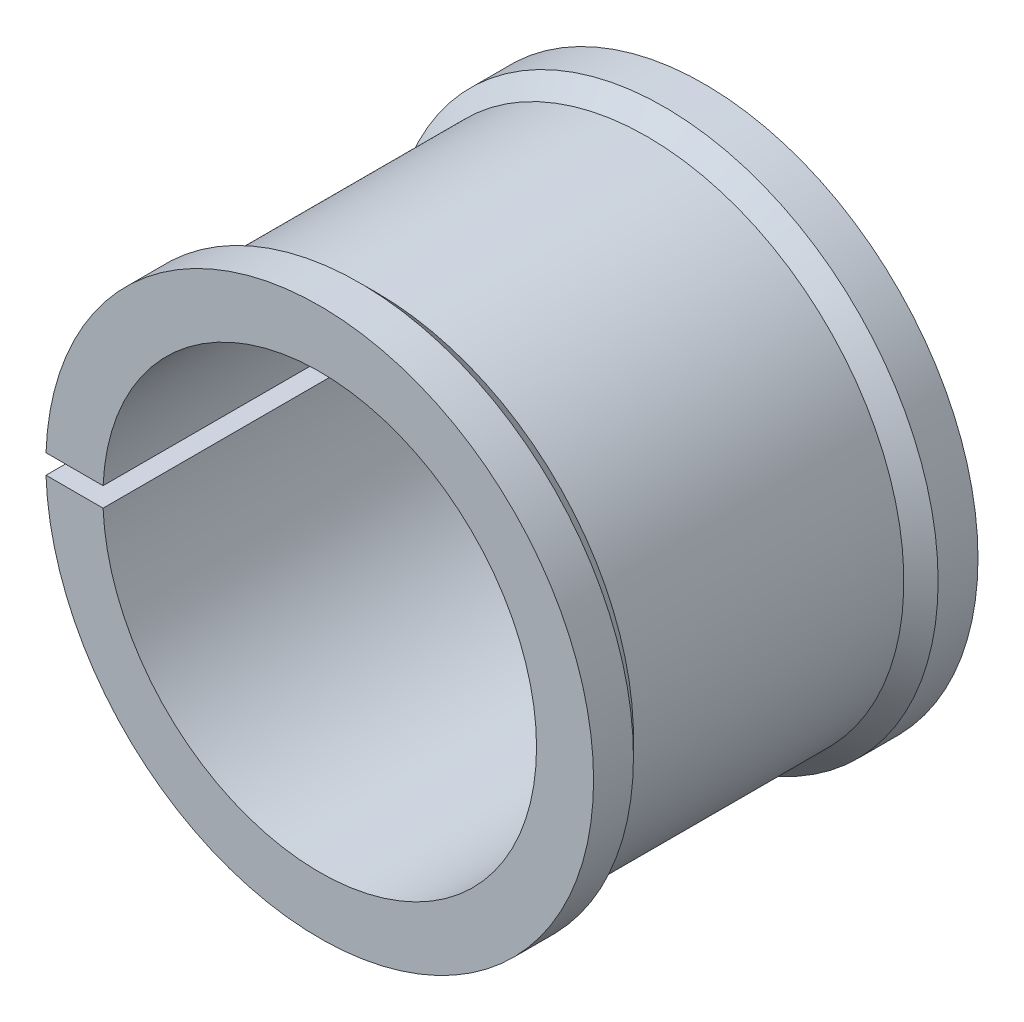
ISO-10303-21;
HEADER;
FILE_DESCRIPTION(('STEP AP214'),'2;1');
FILE_NAME('part.step','',(''),(''),'','','');
FILE_SCHEMA(('AUTOMOTIVE_DESIGN { 1 0 10303 214 1 1 1 1 }'));
ENDSEC;
DATA;
#1=APPLICATION_CONTEXT('core data for automotive mechanical design processes');
#2=APPLICATION_PROTOCOL_DEFINITION('international standard','automotive_design',2000,#1);
#3=PRODUCT_CONTEXT('',#1,'mechanical');
#4=PRODUCT('Part','Part','',(#3));
#5=PRODUCT_RELATED_PRODUCT_CATEGORY('part','',(#4));
#6=PRODUCT_DEFINITION_FORMATION('','',#4);
#7=PRODUCT_DEFINITION_CONTEXT('part definition',#1,'design');
#8=PRODUCT_DEFINITION('design','',#6,#7);
#9=PRODUCT_DEFINITION_SHAPE('','',#8);
#10=(LENGTH_UNIT() NAMED_UNIT(*) SI_UNIT(.MILLI.,.METRE.));
#11=(NAMED_UNIT(*) PLANE_ANGLE_UNIT() SI_UNIT($,.RADIAN.));
#12=(NAMED_UNIT(*) SI_UNIT($,.STERADIAN.) SOLID_ANGLE_UNIT());
#13=UNCERTAINTY_MEASURE_WITH_UNIT(LENGTH_MEASURE(1.E-05),#10,'distance_accuracy_value','');
#14=(GEOMETRIC_REPRESENTATION_CONTEXT(3) GLOBAL_UNCERTAINTY_ASSIGNED_CONTEXT((#13)) GLOBAL_UNIT_ASSIGNED_CONTEXT((#10,
#11,#12)) REPRESENTATION_CONTEXT('',''));
#15=CARTESIAN_POINT('',(0.,0.,0.));
#16=DIRECTION('',(0.,0.,1.));
#17=DIRECTION('',(1.,0.,0.));
#18=AXIS2_PLACEMENT_3D('',#15,#16,#17);
#19=CARTESIAN_POINT('',(0.,0.,22.56));
#20=DIRECTION('',(0.,0.,-1.));
#21=DIRECTION('',(-1.,0.,0.));
#22=AXIS2_PLACEMENT_3D('',#19,#20,#21);
#23=CYLINDRICAL_SURFACE('',#22,25.75);
#24=CARTESIAN_POINT('',(0.,0.,24.8400000000001));
#25=DIRECTION('',(0.,0.,1.));
#26=DIRECTION('',(1.,0.,0.));
#27=AXIS2_PLACEMENT_3D('',#24,#25,#26);
#28=CIRCLE('',#27,25.75);
#29=CARTESIAN_POINT('',(-25.7315346413695,0.975,24.8400000000001));
#30=VERTEX_POINT('',#29);
#31=CARTESIAN_POINT('',(-25.7315346413695,-0.975,24.8400000000001));
#32=VERTEX_POINT('',#31);
#33=EDGE_CURVE('E130',#30,#32,#28,.F.);
#34=ORIENTED_EDGE('',*,*,#33,.T.);
#35=DIRECTION('',(0.,0.,-1.));
#36=VECTOR('',#35,1.);
#37=CARTESIAN_POINT('',(-25.7315346413695,-0.975,22.56));
#38=LINE('',#37,#36);
#39=CARTESIAN_POINT('',(-25.7315346413695,-0.975,-2.28000000000005));
#40=VERTEX_POINT('',#39);
#41=EDGE_CURVE('E149',#32,#40,#38,.T.);
#42=ORIENTED_EDGE('',*,*,#41,.T.);
#43=CARTESIAN_POINT('',(0.,0.,-2.28000000000005));
#44=DIRECTION('',(0.,0.,-1.));
#45=DIRECTION('',(-1.,0.,0.));
#46=AXIS2_PLACEMENT_3D('',#43,#44,#45);
#47=CIRCLE('',#46,25.75);
#48=CARTESIAN_POINT('',(-25.7315346413695,0.975,-2.28000000000005));
#49=VERTEX_POINT('',#48);
#50=EDGE_CURVE('E135',#40,#49,#47,.F.);
#51=ORIENTED_EDGE('',*,*,#50,.T.);
#52=DIRECTION('',(0.,0.,-1.));
#53=VECTOR('',#52,1.);
#54=CARTESIAN_POINT('',(-25.7315346413695,0.975,22.56));
#55=LINE('',#54,#53);
#56=EDGE_CURVE('E151',#49,#30,#55,.F.);
#57=ORIENTED_EDGE('',*,*,#56,.T.);
#58=EDGE_LOOP('',(#34,#42,#51,#57));
#59=FACE_BOUND('',#58,.T.);
#60=ADVANCED_FACE('F32',(#59),#23,.T.);
#61=CARTESIAN_POINT('',(0.,0.,30.56));
#62=DIRECTION('',(0.,0.,-1.));
#63=DIRECTION('',(-1.,0.,0.));
#64=AXIS2_PLACEMENT_3D('',#61,#62,#63);
#65=CYLINDRICAL_SURFACE('',#64,27.47);
#66=CARTESIAN_POINT('',(0.,0.,30.56));
#67=DIRECTION('',(0.,0.,1.));
#68=DIRECTION('',(1.,0.,0.));
#69=AXIS2_PLACEMENT_3D('',#66,#67,#68);
#70=CIRCLE('',#69,27.47);
#71=CARTESIAN_POINT('',(-27.452691580244,-0.975,30.56));
#72=VERTEX_POINT('',#71);
#73=CARTESIAN_POINT('',(-27.452691580244,0.975,30.56));
#74=VERTEX_POINT('',#73);
#75=EDGE_CURVE('E118',#72,#74,#70,.T.);
#76=ORIENTED_EDGE('',*,*,#75,.F.);
#77=DIRECTION('',(0.,0.,-1.));
#78=VECTOR('',#77,1.);
#79=CARTESIAN_POINT('',(-27.452691580244,-0.975,56.));
#80=LINE('',#79,#78);
#81=CARTESIAN_POINT('',(-27.452691580244,-0.975,26.5600000000001));
#82=VERTEX_POINT('',#81);
#83=EDGE_CURVE('E209',#72,#82,#80,.T.);
#84=ORIENTED_EDGE('',*,*,#83,.T.);
#85=CARTESIAN_POINT('',(0.,0.,26.5600000000001));
#86=DIRECTION('',(0.,0.,1.));
#87=DIRECTION('',(1.,0.,0.));
#88=AXIS2_PLACEMENT_3D('',#85,#86,#87);
#89=CIRCLE('',#88,27.47);
#90=CARTESIAN_POINT('',(-27.452691580244,0.975,26.5600000000001));
#91=VERTEX_POINT('',#90);
#92=EDGE_CURVE('E122',#82,#91,#89,.T.);
#93=ORIENTED_EDGE('',*,*,#92,.T.);
#94=DIRECTION('',(0.,0.,-1.));
#95=VECTOR('',#94,1.);
#96=CARTESIAN_POINT('',(-27.452691580244,0.975,56.));
#97=LINE('',#96,#95);
#98=EDGE_CURVE('E103',#74,#91,#97,.T.);
#99=ORIENTED_EDGE('',*,*,#98,.F.);
#100=EDGE_LOOP('',(#76,#84,#93,#99));
#101=FACE_BOUND('',#100,.T.);
#102=ADVANCED_FACE('F183',(#101),#65,.T.);
#103=CARTESIAN_POINT('',(0.,0.,30.56));
#104=DIRECTION('',(0.,0.,1.));
#105=DIRECTION('',(1.,0.,0.));
#106=AXIS2_PLACEMENT_3D('',#103,#104,#105);
#107=PLANE('',#106);
#108=DIRECTION('',(1.,0.,0.));
#109=VECTOR('',#108,1.);
#110=CARTESIAN_POINT('',(0.,-0.975,30.56));
#111=LINE('',#110,#109);
#112=CARTESIAN_POINT('',(-21.7281355619851,-0.975,30.56));
#113=VERTEX_POINT('',#112);
#114=EDGE_CURVE('E56',#72,#113,#111,.T.);
#115=ORIENTED_EDGE('',*,*,#114,.F.);
#116=ORIENTED_EDGE('',*,*,#75,.T.);
#117=DIRECTION('',(-1.,0.,0.));
#118=VECTOR('',#117,1.);
#119=CARTESIAN_POINT('',(0.,0.975,30.56));
#120=LINE('',#119,#118);
#121=CARTESIAN_POINT('',(-21.7281355619851,0.975000000000005,30.56));
#122=VERTEX_POINT('',#121);
#123=EDGE_CURVE('E141',#122,#74,#120,.T.);
#124=ORIENTED_EDGE('',*,*,#123,.F.);
#125=CARTESIAN_POINT('',(0.,0.,30.56));
#126=DIRECTION('',(0.,0.,1.));
#127=DIRECTION('',(1.,0.,0.));
#128=AXIS2_PLACEMENT_3D('',#125,#126,#127);
#129=CIRCLE('',#128,21.75);
#130=EDGE_CURVE('E119',#113,#122,#129,.T.);
#131=ORIENTED_EDGE('',*,*,#130,.F.);
#132=EDGE_LOOP('',(#115,#116,#124,#131));
#133=FACE_BOUND('',#132,.T.);
#134=ADVANCED_FACE('F144',(#133),#107,.T.);
#135=CARTESIAN_POINT('',(0.,0.,26.5600000000001));
#136=DIRECTION('',(0.,0.,1.));
#137=DIRECTION('',(1.,0.,0.));
#138=AXIS2_PLACEMENT_3D('',#135,#136,#137);
#139=CONICAL_SURFACE('',#138,27.47,0.785398163397443);
#140=CARTESIAN_POINT('',(-18.5120586754731,-0.975,17.6277167257502));
#141=CARTESIAN_POINT('',(-19.8710983765003,-0.975,18.9849092384914));
#142=CARTESIAN_POINT('',(-21.2299681156793,-0.975,20.3422719010559));
#143=CARTESIAN_POINT('',(-23.9474721602738,-0.975,23.0572328495183));
#144=CARTESIAN_POINT('',(-25.3061064656926,-0.975,24.4148311354128));
#145=CARTESIAN_POINT('',(-28.0232441553789,-0.975,27.1301586768713));
#146=CARTESIAN_POINT('',(-29.3817475396479,-0.975,28.4878879324339));
#147=CARTESIAN_POINT('',(-32.0986622576701,-0.975,31.2034385761543));
#148=CARTESIAN_POINT('',(-33.4570735914221,-0.975,32.5612599643134));
#149=CARTESIAN_POINT('',(-34.8154583105851,-0.975,33.9191079756014));
#150=B_SPLINE_CURVE_WITH_KNOTS('',3,(#140,#141,#142,#143,#144,#145,#146,#147,#148,#149),
.UNSPECIFIED.,.F.,.F.,(4,2,2,2,4),(0.,5.76199992725413,11.5239997760374,17.2859995640358,
23.0479994261822),.UNSPECIFIED.);
#151=EDGE_CURVE('E170',#32,#82,#150,.T.);
#152=ORIENTED_EDGE('',*,*,#151,.F.);
#153=ORIENTED_EDGE('',*,*,#33,.F.);
#154=CARTESIAN_POINT('',(-34.8154583105851,0.975,33.9191079756014));
#155=CARTESIAN_POINT('',(-33.4570735914221,0.975,32.5612599643134));
#156=CARTESIAN_POINT('',(-32.0986622576701,0.975,31.2034385761543));
#157=CARTESIAN_POINT('',(-29.3817475396479,0.975,28.4878879324339));
#158=CARTESIAN_POINT('',(-28.0232441553789,0.975,27.1301586768713));
#159=CARTESIAN_POINT('',(-25.3061064656926,0.975,24.4148311354128));
#160=CARTESIAN_POINT('',(-23.9474721602738,0.975,23.0572328495183));
#161=CARTESIAN_POINT('',(-21.2299681156793,0.975,20.3422719010559));
#162=CARTESIAN_POINT('',(-19.8710983765003,0.975,18.9849092384914));
#163=CARTESIAN_POINT('',(-18.5120586754731,0.975,17.6277167257502));
#164=B_SPLINE_CURVE_WITH_KNOTS('',3,(#154,#155,#156,#157,#158,#159,#160,#161,#162,#163),
.UNSPECIFIED.,.F.,.F.,(4,2,2,2,4),(0.,5.7619998621464,11.5239996501449,17.2859994989281,
23.0479994261822),.UNSPECIFIED.);
#165=EDGE_CURVE('E147',#91,#30,#164,.T.);
#166=ORIENTED_EDGE('',*,*,#165,.F.);
#167=ORIENTED_EDGE('',*,*,#92,.F.);
#168=EDGE_LOOP('',(#152,#153,#166,#167));
#169=FACE_BOUND('',#168,.T.);
#170=ADVANCED_FACE('F175',(#169),#139,.T.);
#171=CARTESIAN_POINT('',(0.,0.,-8.));
#172=DIRECTION('',(0.,0.,1.));
#173=DIRECTION('',(1.,0.,0.));
#174=AXIS2_PLACEMENT_3D('',#171,#172,#173);
#175=CYLINDRICAL_SURFACE('',#174,27.47);
#176=CARTESIAN_POINT('',(0.,0.,-4.00000000000007));
#177=DIRECTION('',(0.,0.,-1.));
#178=DIRECTION('',(-1.,0.,0.));
#179=AXIS2_PLACEMENT_3D('',#176,#177,#178);
#180=CIRCLE('',#179,27.47);
#181=CARTESIAN_POINT('',(-27.452691580244,0.975,-4.00000000000007));
#182=VERTEX_POINT('',#181);
#183=CARTESIAN_POINT('',(-27.452691580244,-0.975,-4.00000000000007));
#184=VERTEX_POINT('',#183);
#185=EDGE_CURVE('E133',#182,#184,#180,.T.);
#186=ORIENTED_EDGE('',*,*,#185,.T.);
#187=CARTESIAN_POINT('',(-27.452691580244,-0.975,-8.));
#188=VERTEX_POINT('',#187);
#189=EDGE_CURVE('E117',#184,#188,#80,.T.);
#190=ORIENTED_EDGE('',*,*,#189,.T.);
#191=CARTESIAN_POINT('',(0.,0.,-8.));
#192=DIRECTION('',(0.,0.,-1.));
#193=DIRECTION('',(-1.,0.,0.));
#194=AXIS2_PLACEMENT_3D('',#191,#192,#193);
#195=CIRCLE('',#194,27.47);
#196=CARTESIAN_POINT('',(-27.452691580244,0.975,-8.));
#197=VERTEX_POINT('',#196);
#198=EDGE_CURVE('E111',#197,#188,#195,.T.);
#199=ORIENTED_EDGE('',*,*,#198,.F.);
#200=EDGE_CURVE('E95',#182,#197,#97,.T.);
#201=ORIENTED_EDGE('',*,*,#200,.F.);
#202=EDGE_LOOP('',(#186,#190,#199,#201));
#203=FACE_BOUND('',#202,.T.);
#204=ADVANCED_FACE('F116',(#203),#175,.T.);
#205=CARTESIAN_POINT('',(0.,0.,-8.));
#206=DIRECTION('',(0.,0.,-1.));
#207=DIRECTION('',(-1.,0.,0.));
#208=AXIS2_PLACEMENT_3D('',#205,#206,#207);
#209=PLANE('',#208);
#210=DIRECTION('',(-1.,0.,0.));
#211=VECTOR('',#210,1.);
#212=CARTESIAN_POINT('',(-21.7281355619851,-0.975,-8.));
#213=LINE('',#212,#211);
#214=CARTESIAN_POINT('',(-21.7281355619851,-0.975,-8.));
#215=VERTEX_POINT('',#214);
#216=EDGE_CURVE('E104',#215,#188,#213,.T.);
#217=ORIENTED_EDGE('',*,*,#216,.F.);
#218=CARTESIAN_POINT('',(0.,0.,-8.));
#219=DIRECTION('',(0.,0.,-1.));
#220=DIRECTION('',(-1.,0.,0.));
#221=AXIS2_PLACEMENT_3D('',#218,#219,#220);
#222=CIRCLE('',#221,21.75);
#223=CARTESIAN_POINT('',(-21.7281355619851,0.975,-8.));
#224=VERTEX_POINT('',#223);
#225=EDGE_CURVE('E113',#224,#215,#222,.T.);
#226=ORIENTED_EDGE('',*,*,#225,.F.);
#227=DIRECTION('',(1.,0.,0.));
#228=VECTOR('',#227,1.);
#229=CARTESIAN_POINT('',(-21.7281355619851,0.975,-8.));
#230=LINE('',#229,#228);
#231=EDGE_CURVE('E48',#197,#224,#230,.T.);
#232=ORIENTED_EDGE('',*,*,#231,.F.);
#233=ORIENTED_EDGE('',*,*,#198,.T.);
#234=EDGE_LOOP('',(#217,#226,#232,#233));
#235=FACE_BOUND('',#234,.T.);
#236=ADVANCED_FACE('F110',(#235),#209,.T.);
#237=CARTESIAN_POINT('',(0.,0.,-4.00000000000007));
#238=DIRECTION('',(0.,0.,-1.));
#239=DIRECTION('',(-1.,0.,0.));
#240=AXIS2_PLACEMENT_3D('',#237,#238,#239);
#241=CONICAL_SURFACE('',#240,27.47,0.785398163397443);
#242=CARTESIAN_POINT('',(-34.8154583105851,-0.975,-11.3591079756014));
#243=CARTESIAN_POINT('',(-33.4570735914221,-0.975,-10.0012599643134));
#244=CARTESIAN_POINT('',(-32.0986622576701,-0.975,-8.64343857615432));
#245=CARTESIAN_POINT('',(-29.3817475396479,-0.975,-5.92788793243387));
#246=CARTESIAN_POINT('',(-28.0232441553789,-0.975,-4.57015867687133));
#247=CARTESIAN_POINT('',(-25.3061064656926,-0.975,-1.85483113541284));
#248=CARTESIAN_POINT('',(-23.9474721602738,-0.975,-0.497232849518281));
#249=CARTESIAN_POINT('',(-21.2299681156793,-0.975,2.21772809894405));
#250=CARTESIAN_POINT('',(-19.8710983765003,-0.975,3.57509076150862));
#251=CARTESIAN_POINT('',(-18.5120586754731,-0.975,4.93228327424981));
#252=B_SPLINE_CURVE_WITH_KNOTS('',3,(#242,#243,#244,#245,#246,#247,#248,#249,#250,#251),
.UNSPECIFIED.,.F.,.F.,(4,2,2,2,4),(0.,5.7619998621464,11.5239996501449,17.2859994989281,
23.0479994261823),.UNSPECIFIED.);
#253=EDGE_CURVE('E146',#184,#40,#252,.T.);
#254=ORIENTED_EDGE('',*,*,#253,.F.);
#255=ORIENTED_EDGE('',*,*,#185,.F.);
#256=CARTESIAN_POINT('',(-18.5120586754731,0.975,4.93228327424981));
#257=CARTESIAN_POINT('',(-19.8710983765003,0.975,3.57509076150862));
#258=CARTESIAN_POINT('',(-21.2299681156793,0.975,2.21772809894405));
#259=CARTESIAN_POINT('',(-23.9474721602738,0.975,-0.497232849518284));
#260=CARTESIAN_POINT('',(-25.3061064656926,0.975,-1.85483113541284));
#261=CARTESIAN_POINT('',(-28.0232441553789,0.975,-4.57015867687133));
#262=CARTESIAN_POINT('',(-29.3817475396479,0.975,-5.92788793243387));
#263=CARTESIAN_POINT('',(-32.0986622576701,0.975,-8.64343857615432));
#264=CARTESIAN_POINT('',(-33.4570735914221,0.975,-10.0012599643134));
#265=CARTESIAN_POINT('',(-34.8154583105851,0.975,-11.3591079756014));
#266=B_SPLINE_CURVE_WITH_KNOTS('',3,(#256,#257,#258,#259,#260,#261,#262,#263,#264,#265),
.UNSPECIFIED.,.F.,.F.,(4,2,2,2,4),(0.,5.76199992725413,11.5239997760374,17.2859995640359,
23.0479994261823),.UNSPECIFIED.);
#267=EDGE_CURVE('E98',#49,#182,#266,.T.);
#268=ORIENTED_EDGE('',*,*,#267,.F.);
#269=ORIENTED_EDGE('',*,*,#50,.F.);
#270=EDGE_LOOP('',(#254,#255,#268,#269));
#271=FACE_BOUND('',#270,.T.);
#272=ADVANCED_FACE('F34',(#271),#241,.T.);
#273=CARTESIAN_POINT('',(0.,0.,0.));
#274=DIRECTION('',(0.,0.,1.));
#275=DIRECTION('',(1.,0.,0.));
#276=AXIS2_PLACEMENT_3D('',#273,#274,#275);
#277=CYLINDRICAL_SURFACE('',#276,21.75);
#278=ORIENTED_EDGE('',*,*,#225,.T.);
#279=DIRECTION('',(0.,0.,1.));
#280=VECTOR('',#279,1.);
#281=CARTESIAN_POINT('',(-21.7281355619851,-0.975,0.));
#282=LINE('',#281,#280);
#283=EDGE_CURVE('E11',#215,#113,#282,.T.);
#284=ORIENTED_EDGE('',*,*,#283,.T.);
#285=ORIENTED_EDGE('',*,*,#130,.T.);
#286=DIRECTION('',(0.,0.,1.));
#287=VECTOR('',#286,1.);
#288=CARTESIAN_POINT('',(-21.7281355619851,0.975,0.));
#289=LINE('',#288,#287);
#290=EDGE_CURVE('E41',#122,#224,#289,.F.);
#291=ORIENTED_EDGE('',*,*,#290,.T.);
#292=EDGE_LOOP('',(#278,#284,#285,#291));
#293=FACE_BOUND('',#292,.T.);
#294=ADVANCED_FACE('F138',(#293),#277,.F.);
#295=CARTESIAN_POINT('',(-21.7281355619851,0.975,56.));
#296=DIRECTION('',(0.,1.,0.));
#297=DIRECTION('',(0.,0.,1.));
#298=AXIS2_PLACEMENT_3D('',#295,#296,#297);
#299=PLANE('',#298);
#300=ORIENTED_EDGE('',*,*,#123,.T.);
#301=ORIENTED_EDGE('',*,*,#98,.T.);
#302=ORIENTED_EDGE('',*,*,#165,.T.);
#303=ORIENTED_EDGE('',*,*,#56,.F.);
#304=ORIENTED_EDGE('',*,*,#267,.T.);
#305=ORIENTED_EDGE('',*,*,#200,.T.);
#306=ORIENTED_EDGE('',*,*,#231,.T.);
#307=ORIENTED_EDGE('',*,*,#290,.F.);
#308=EDGE_LOOP('',(#300,#301,#302,#303,#304,#305,#306,#307));
#309=FACE_BOUND('',#308,.T.);
#310=ADVANCED_FACE('F96',(#309),#299,.F.);
#311=CARTESIAN_POINT('',(-21.7281355619851,-0.975,56.));
#312=DIRECTION('',(0.,-1.,0.));
#313=DIRECTION('',(0.,0.,-1.));
#314=AXIS2_PLACEMENT_3D('',#311,#312,#313);
#315=PLANE('',#314);
#316=ORIENTED_EDGE('',*,*,#114,.T.);
#317=ORIENTED_EDGE('',*,*,#283,.F.);
#318=ORIENTED_EDGE('',*,*,#216,.T.);
#319=ORIENTED_EDGE('',*,*,#189,.F.);
#320=ORIENTED_EDGE('',*,*,#253,.T.);
#321=ORIENTED_EDGE('',*,*,#41,.F.);
#322=ORIENTED_EDGE('',*,*,#151,.T.);
#323=ORIENTED_EDGE('',*,*,#83,.F.);
#324=EDGE_LOOP('',(#316,#317,#318,#319,#320,#321,#322,#323));
#325=FACE_BOUND('',#324,.T.);
#326=ADVANCED_FACE('F164',(#325),#315,.F.);
#327=CLOSED_SHELL('',(#60,#102,#134,#170,#204,#236,#272,#294,#310,#326));
#328=MANIFOLD_SOLID_BREP('B2',#327);
#329=ADVANCED_BREP_SHAPE_REPRESENTATION('',(#18,#328),#14);
#330=SHAPE_DEFINITION_REPRESENTATION(#9,#329);
ENDSEC;
END-ISO-10303-21;
